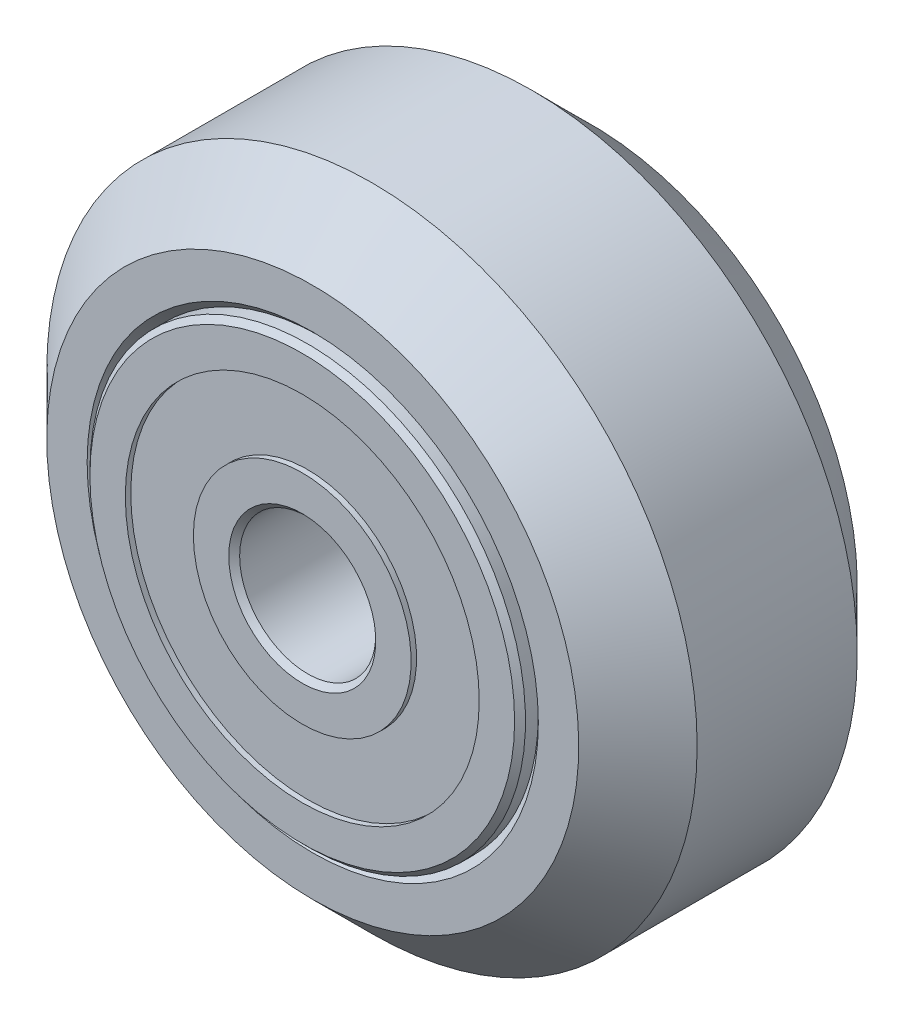
ISO-10303-21;
HEADER;
FILE_DESCRIPTION(('STEP AP214'),'2;1');
FILE_NAME('part.step','',(''),(''),'','','');
FILE_SCHEMA(('AUTOMOTIVE_DESIGN { 1 0 10303 214 1 1 1 1 }'));
ENDSEC;
DATA;
#1=APPLICATION_CONTEXT('core data for automotive mechanical design processes');
#2=APPLICATION_PROTOCOL_DEFINITION('international standard','automotive_design',2000,#1);
#3=PRODUCT_CONTEXT('',#1,'mechanical');
#4=PRODUCT('Part','Part','',(#3));
#5=PRODUCT_RELATED_PRODUCT_CATEGORY('part','',(#4));
#6=PRODUCT_DEFINITION_FORMATION('','',#4);
#7=PRODUCT_DEFINITION_CONTEXT('part definition',#1,'design');
#8=PRODUCT_DEFINITION('design','',#6,#7);
#9=PRODUCT_DEFINITION_SHAPE('','',#8);
#10=(LENGTH_UNIT() NAMED_UNIT(*) SI_UNIT(.MILLI.,.METRE.));
#11=(NAMED_UNIT(*) PLANE_ANGLE_UNIT() SI_UNIT($,.RADIAN.));
#12=(NAMED_UNIT(*) SI_UNIT($,.STERADIAN.) SOLID_ANGLE_UNIT());
#13=UNCERTAINTY_MEASURE_WITH_UNIT(LENGTH_MEASURE(1.E-05),#10,'distance_accuracy_value','');
#14=(GEOMETRIC_REPRESENTATION_CONTEXT(3) GLOBAL_UNCERTAINTY_ASSIGNED_CONTEXT((#13)) GLOBAL_UNIT_ASSIGNED_CONTEXT((#10,
#11,#12)) REPRESENTATION_CONTEXT('',''));
#15=CARTESIAN_POINT('',(0.,0.,0.));
#16=DIRECTION('',(0.,0.,1.));
#17=DIRECTION('',(1.,0.,0.));
#18=AXIS2_PLACEMENT_3D('',#15,#16,#17);
#19=CARTESIAN_POINT('',(0.,0.,0.499999999999998));
#20=DIRECTION('',(0.,0.,1.));
#21=DIRECTION('',(1.,0.,0.));
#22=AXIS2_PLACEMENT_3D('',#19,#20,#21);
#23=PLANE('',#22);
#24=CARTESIAN_POINT('',(0.,0.,0.499999999999998));
#25=DIRECTION('',(0.,0.,1.));
#26=DIRECTION('',(1.,0.,0.));
#27=AXIS2_PLACEMENT_3D('',#24,#25,#26);
#28=CIRCLE('',#27,4.);
#29=CARTESIAN_POINT('',(4.,0.,0.499999999999998));
#30=VERTEX_POINT('',#29);
#31=EDGE_CURVE('P0_E10',#30,#30,#28,.T.);
#32=ORIENTED_EDGE('',*,*,#31,.T.);
#33=EDGE_LOOP('',(#32));
#34=FACE_BOUND('',#33,.T.);
#35=CARTESIAN_POINT('',(0.,0.,0.499999999999998));
#36=DIRECTION('',(0.,0.,1.));
#37=DIRECTION('',(1.,0.,0.));
#38=AXIS2_PLACEMENT_3D('',#35,#36,#37);
#39=CIRCLE('',#38,2.55);
#40=CARTESIAN_POINT('',(2.55,0.,0.499999999999998));
#41=VERTEX_POINT('',#40);
#42=EDGE_CURVE('P0_E25',#41,#41,#39,.T.);
#43=ORIENTED_EDGE('',*,*,#42,.F.);
#44=EDGE_LOOP('',(#43));
#45=FACE_BOUND('',#44,.T.);
#46=ADVANCED_FACE('P0_F14',(#34,#45),#23,.T.);
#47=CARTESIAN_POINT('',(0.,0.,-0.500000000000002));
#48=DIRECTION('',(0.,0.,1.));
#49=DIRECTION('',(1.,0.,0.));
#50=AXIS2_PLACEMENT_3D('',#47,#48,#49);
#51=PLANE('',#50);
#52=CARTESIAN_POINT('',(0.,0.,-0.500000000000002));
#53=DIRECTION('',(0.,0.,1.));
#54=DIRECTION('',(1.,0.,0.));
#55=AXIS2_PLACEMENT_3D('',#52,#53,#54);
#56=CIRCLE('',#55,4.);
#57=CARTESIAN_POINT('',(4.,0.,-0.500000000000002));
#58=VERTEX_POINT('',#57);
#59=EDGE_CURVE('P0_E18',#58,#58,#56,.T.);
#60=ORIENTED_EDGE('',*,*,#59,.F.);
#61=EDGE_LOOP('',(#60));
#62=FACE_BOUND('',#61,.T.);
#63=CARTESIAN_POINT('',(0.,0.,-0.500000000000002));
#64=DIRECTION('',(0.,0.,1.));
#65=DIRECTION('',(1.,0.,0.));
#66=AXIS2_PLACEMENT_3D('',#63,#64,#65);
#67=CIRCLE('',#66,2.55);
#68=CARTESIAN_POINT('',(2.55,0.,-0.500000000000002));
#69=VERTEX_POINT('',#68);
#70=EDGE_CURVE('P0_E27',#69,#69,#67,.T.);
#71=ORIENTED_EDGE('',*,*,#70,.T.);
#72=EDGE_LOOP('',(#71));
#73=FACE_BOUND('',#72,.T.);
#74=ADVANCED_FACE('P0_F37',(#62,#73),#51,.F.);
#75=CARTESIAN_POINT('',(0.,0.,0.499999999999998));
#76=DIRECTION('',(0.,0.,-1.));
#77=DIRECTION('',(-1.,0.,0.));
#78=AXIS2_PLACEMENT_3D('',#75,#76,#77);
#79=CYLINDRICAL_SURFACE('',#78,4.);
#80=ORIENTED_EDGE('',*,*,#31,.F.);
#81=EDGE_LOOP('',(#80));
#82=FACE_BOUND('',#81,.T.);
#83=ORIENTED_EDGE('',*,*,#59,.T.);
#84=EDGE_LOOP('',(#83));
#85=FACE_BOUND('',#84,.T.);
#86=ADVANCED_FACE('P0_F16',(#82,#85),#79,.T.);
#87=CARTESIAN_POINT('',(0.,0.,0.499999999999998));
#88=DIRECTION('',(0.,0.,-1.));
#89=DIRECTION('',(-1.,0.,0.));
#90=AXIS2_PLACEMENT_3D('',#87,#88,#89);
#91=CYLINDRICAL_SURFACE('',#90,2.55);
#92=ORIENTED_EDGE('',*,*,#42,.T.);
#93=EDGE_LOOP('',(#92));
#94=FACE_BOUND('',#93,.T.);
#95=ORIENTED_EDGE('',*,*,#70,.F.);
#96=EDGE_LOOP('',(#95));
#97=FACE_BOUND('',#96,.T.);
#98=ADVANCED_FACE('P0_F33',(#94,#97),#91,.F.);
#99=CLOSED_SHELL('',(#46,#74,#86,#98));
#100=MANIFOLD_SOLID_BREP('P0_B1',#99);
#101=CARTESIAN_POINT('',(0.,0.,5.5));
#102=DIRECTION('',(0.,0.,-1.));
#103=DIRECTION('',(-1.,0.,0.));
#104=AXIS2_PLACEMENT_3D('',#101,#102,#103);
#105=PLANE('',#104);
#106=CARTESIAN_POINT('',(0.,0.,5.5));
#107=DIRECTION('',(0.,0.,-1.));
#108=DIRECTION('',(-1.,0.,0.));
#109=AXIS2_PLACEMENT_3D('',#106,#107,#108);
#110=CIRCLE('',#109,7.8);
#111=CARTESIAN_POINT('',(-7.8,0.,5.5));
#112=VERTEX_POINT('',#111);
#113=EDGE_CURVE('P1_E10',#112,#112,#110,.F.);
#114=ORIENTED_EDGE('',*,*,#113,.T.);
#115=EDGE_LOOP('',(#114));
#116=FACE_BOUND('',#115,.T.);
#117=CARTESIAN_POINT('',(0.,0.,5.5));
#118=DIRECTION('',(0.,0.,-1.));
#119=DIRECTION('',(-1.,0.,0.));
#120=AXIS2_PLACEMENT_3D('',#117,#118,#119);
#121=CIRCLE('',#120,6.5);
#122=CARTESIAN_POINT('',(-6.5,0.,5.5));
#123=VERTEX_POINT('',#122);
#124=EDGE_CURVE('P1_E56',#123,#123,#121,.T.);
#125=ORIENTED_EDGE('',*,*,#124,.T.);
#126=EDGE_LOOP('',(#125));
#127=FACE_BOUND('',#126,.T.);
#128=ADVANCED_FACE('P1_F14',(#116,#127),#105,.F.);
#129=CARTESIAN_POINT('',(0.,0.,0.499999999999998));
#130=DIRECTION('',(0.,0.,-1.));
#131=DIRECTION('',(-1.,0.,0.));
#132=AXIS2_PLACEMENT_3D('',#129,#130,#131);
#133=PLANE('',#132);
#134=CARTESIAN_POINT('',(0.,0.,0.499999999999998));
#135=DIRECTION('',(0.,0.,-1.));
#136=DIRECTION('',(-1.,0.,0.));
#137=AXIS2_PLACEMENT_3D('',#134,#135,#136);
#138=CIRCLE('',#137,2.7);
#139=CARTESIAN_POINT('',(-2.7,0.,0.499999999999998));
#140=VERTEX_POINT('',#139);
#141=EDGE_CURVE('P1_E29',#140,#140,#138,.F.);
#142=ORIENTED_EDGE('',*,*,#141,.T.);
#143=EDGE_LOOP('',(#142));
#144=FACE_BOUND('',#143,.T.);
#145=CARTESIAN_POINT('',(0.,0.,0.499999999999998));
#146=DIRECTION('',(0.,0.,-1.));
#147=DIRECTION('',(-1.,0.,0.));
#148=AXIS2_PLACEMENT_3D('',#145,#146,#147);
#149=CIRCLE('',#148,4.);
#150=CARTESIAN_POINT('',(-4.,0.,0.499999999999998));
#151=VERTEX_POINT('',#150);
#152=EDGE_CURVE('P1_E50',#151,#151,#149,.T.);
#153=ORIENTED_EDGE('',*,*,#152,.T.);
#154=EDGE_LOOP('',(#153));
#155=FACE_BOUND('',#154,.T.);
#156=ADVANCED_FACE('P1_F95',(#144,#155),#133,.T.);
#157=CARTESIAN_POINT('',(0.,0.,0.499999999999998));
#158=DIRECTION('',(0.,0.,1.));
#159=DIRECTION('',(1.,0.,0.));
#160=AXIS2_PLACEMENT_3D('',#157,#158,#159);
#161=CYLINDRICAL_SURFACE('',#160,8.);
#162=CARTESIAN_POINT('',(0.,0.,5.3));
#163=DIRECTION('',(0.,0.,-1.));
#164=DIRECTION('',(-1.,0.,0.));
#165=AXIS2_PLACEMENT_3D('',#162,#163,#164);
#166=CIRCLE('',#165,8.);
#167=CARTESIAN_POINT('',(-8.,0.,5.3));
#168=VERTEX_POINT('',#167);
#169=EDGE_CURVE('P1_E21',#168,#168,#166,.T.);
#170=ORIENTED_EDGE('',*,*,#169,.T.);
#171=EDGE_LOOP('',(#170));
#172=FACE_BOUND('',#171,.T.);
#173=CARTESIAN_POINT('',(0.,0.,0.499999999999998));
#174=DIRECTION('',(0.,0.,-1.));
#175=DIRECTION('',(-1.,0.,0.));
#176=AXIS2_PLACEMENT_3D('',#173,#174,#175);
#177=CIRCLE('',#176,8.);
#178=CARTESIAN_POINT('',(-8.,0.,0.499999999999998));
#179=VERTEX_POINT('',#178);
#180=EDGE_CURVE('P1_E43',#179,#179,#177,.T.);
#181=ORIENTED_EDGE('',*,*,#180,.F.);
#182=EDGE_LOOP('',(#181));
#183=FACE_BOUND('',#182,.T.);
#184=ADVANCED_FACE('P1_F92',(#172,#183),#161,.T.);
#185=CARTESIAN_POINT('',(0.,0.,0.499999999999998));
#186=DIRECTION('',(0.,0.,-1.));
#187=DIRECTION('',(-1.,0.,0.));
#188=AXIS2_PLACEMENT_3D('',#185,#186,#187);
#189=CIRCLE('',#188,6.7);
#190=CARTESIAN_POINT('',(-6.7,0.,0.499999999999998));
#191=VERTEX_POINT('',#190);
#192=EDGE_CURVE('P1_E40',#191,#191,#189,.F.);
#193=ORIENTED_EDGE('',*,*,#192,.T.);
#194=EDGE_LOOP('',(#193));
#195=FACE_BOUND('',#194,.T.);
#196=ORIENTED_EDGE('',*,*,#180,.T.);
#197=EDGE_LOOP('',(#196));
#198=FACE_BOUND('',#197,.T.);
#199=ADVANCED_FACE('P1_F81',(#195,#198),#133,.T.);
#200=CARTESIAN_POINT('',(0.,0.,5.5));
#201=DIRECTION('',(0.,0.,-1.));
#202=DIRECTION('',(-1.,0.,0.));
#203=AXIS2_PLACEMENT_3D('',#200,#201,#202);
#204=CIRCLE('',#203,2.7);
#205=CARTESIAN_POINT('',(-2.7,0.,5.5));
#206=VERTEX_POINT('',#205);
#207=EDGE_CURVE('P1_E25',#206,#206,#204,.T.);
#208=ORIENTED_EDGE('',*,*,#207,.T.);
#209=EDGE_LOOP('',(#208));
#210=FACE_BOUND('',#209,.T.);
#211=CARTESIAN_POINT('',(0.,0.,5.5));
#212=DIRECTION('',(0.,0.,-1.));
#213=DIRECTION('',(-1.,0.,0.));
#214=AXIS2_PLACEMENT_3D('',#211,#212,#213);
#215=CIRCLE('',#214,4.);
#216=CARTESIAN_POINT('',(-4.,0.,5.5));
#217=VERTEX_POINT('',#216);
#218=EDGE_CURVE('P1_E62',#217,#217,#215,.T.);
#219=ORIENTED_EDGE('',*,*,#218,.F.);
#220=EDGE_LOOP('',(#219));
#221=FACE_BOUND('',#220,.T.);
#222=ADVANCED_FACE('P1_F78',(#210,#221),#105,.F.);
#223=CARTESIAN_POINT('',(0.,0.,5.5));
#224=DIRECTION('',(0.,0.,-1.));
#225=DIRECTION('',(-1.,0.,0.));
#226=AXIS2_PLACEMENT_3D('',#223,#224,#225);
#227=CYLINDRICAL_SURFACE('',#226,2.5);
#228=CARTESIAN_POINT('',(0.,0.,0.699999999999991));
#229=DIRECTION('',(0.,0.,-1.));
#230=DIRECTION('',(-1.,0.,0.));
#231=AXIS2_PLACEMENT_3D('',#228,#229,#230);
#232=CIRCLE('',#231,2.5);
#233=CARTESIAN_POINT('',(-2.5,0.,0.699999999999991));
#234=VERTEX_POINT('',#233);
#235=EDGE_CURVE('P1_E34',#234,#234,#232,.T.);
#236=ORIENTED_EDGE('',*,*,#235,.T.);
#237=EDGE_LOOP('',(#236));
#238=FACE_BOUND('',#237,.T.);
#239=CARTESIAN_POINT('',(0.,0.,5.3));
#240=DIRECTION('',(0.,0.,-1.));
#241=DIRECTION('',(-1.,0.,0.));
#242=AXIS2_PLACEMENT_3D('',#239,#240,#241);
#243=CIRCLE('',#242,2.5);
#244=CARTESIAN_POINT('',(-2.5,0.,5.3));
#245=VERTEX_POINT('',#244);
#246=EDGE_CURVE('P1_E37',#245,#245,#243,.F.);
#247=ORIENTED_EDGE('',*,*,#246,.T.);
#248=EDGE_LOOP('',(#247));
#249=FACE_BOUND('',#248,.T.);
#250=ADVANCED_FACE('P1_F80',(#238,#249),#227,.F.);
#251=CARTESIAN_POINT('',(0.,0.,0.699999999999998));
#252=DIRECTION('',(0.,0.,-1.));
#253=DIRECTION('',(-1.,0.,0.));
#254=AXIS2_PLACEMENT_3D('',#251,#252,#253);
#255=PLANE('',#254);
#256=CARTESIAN_POINT('',(0.,0.,0.699999999999998));
#257=DIRECTION('',(0.,0.,-1.));
#258=DIRECTION('',(-1.,0.,0.));
#259=AXIS2_PLACEMENT_3D('',#256,#257,#258);
#260=CIRCLE('',#259,4.);
#261=CARTESIAN_POINT('',(-4.,0.,0.699999999999998));
#262=VERTEX_POINT('',#261);
#263=EDGE_CURVE('P1_E49',#262,#262,#260,.T.);
#264=ORIENTED_EDGE('',*,*,#263,.F.);
#265=EDGE_LOOP('',(#264));
#266=FACE_BOUND('',#265,.T.);
#267=CARTESIAN_POINT('',(0.,0.,0.699999999999998));
#268=DIRECTION('',(0.,0.,-1.));
#269=DIRECTION('',(-1.,0.,0.));
#270=AXIS2_PLACEMENT_3D('',#267,#268,#269);
#271=CIRCLE('',#270,6.5);
#272=CARTESIAN_POINT('',(-6.5,0.,0.699999999999998));
#273=VERTEX_POINT('',#272);
#274=EDGE_CURVE('P1_E46',#273,#273,#271,.T.);
#275=ORIENTED_EDGE('',*,*,#274,.T.);
#276=EDGE_LOOP('',(#275));
#277=FACE_BOUND('',#276,.T.);
#278=ADVANCED_FACE('P1_F89',(#266,#277),#255,.T.);
#279=CARTESIAN_POINT('',(0.,0.,0.699999999999998));
#280=DIRECTION('',(0.,0.,-1.));
#281=DIRECTION('',(-1.,0.,0.));
#282=AXIS2_PLACEMENT_3D('',#279,#280,#281);
#283=CYLINDRICAL_SURFACE('',#282,4.);
#284=ORIENTED_EDGE('',*,*,#263,.T.);
#285=EDGE_LOOP('',(#284));
#286=FACE_BOUND('',#285,.T.);
#287=ORIENTED_EDGE('',*,*,#152,.F.);
#288=EDGE_LOOP('',(#287));
#289=FACE_BOUND('',#288,.T.);
#290=ADVANCED_FACE('P1_F111',(#286,#289),#283,.T.);
#291=CARTESIAN_POINT('',(0.,0.,5.3));
#292=DIRECTION('',(0.,0.,1.));
#293=DIRECTION('',(-1.,0.,0.));
#294=AXIS2_PLACEMENT_3D('',#291,#292,#293);
#295=PLANE('',#294);
#296=CARTESIAN_POINT('',(0.,0.,5.3));
#297=DIRECTION('',(0.,0.,-1.));
#298=DIRECTION('',(-1.,0.,0.));
#299=AXIS2_PLACEMENT_3D('',#296,#297,#298);
#300=CIRCLE('',#299,6.5);
#301=CARTESIAN_POINT('',(-6.5,0.,5.3));
#302=VERTEX_POINT('',#301);
#303=EDGE_CURVE('P1_E53',#302,#302,#300,.T.);
#304=ORIENTED_EDGE('',*,*,#303,.F.);
#305=EDGE_LOOP('',(#304));
#306=FACE_BOUND('',#305,.T.);
#307=CARTESIAN_POINT('',(0.,0.,5.3));
#308=DIRECTION('',(0.,0.,-1.));
#309=DIRECTION('',(-1.,0.,0.));
#310=AXIS2_PLACEMENT_3D('',#307,#308,#309);
#311=CIRCLE('',#310,4.);
#312=CARTESIAN_POINT('',(-4.,0.,5.3));
#313=VERTEX_POINT('',#312);
#314=EDGE_CURVE('P1_E59',#313,#313,#311,.T.);
#315=ORIENTED_EDGE('',*,*,#314,.T.);
#316=EDGE_LOOP('',(#315));
#317=FACE_BOUND('',#316,.T.);
#318=ADVANCED_FACE('P1_F68',(#306,#317),#295,.T.);
#319=CARTESIAN_POINT('',(0.,0.,5.3));
#320=DIRECTION('',(0.,0.,1.));
#321=DIRECTION('',(1.,0.,0.));
#322=AXIS2_PLACEMENT_3D('',#319,#320,#321);
#323=CYLINDRICAL_SURFACE('',#322,6.5);
#324=ORIENTED_EDGE('',*,*,#303,.T.);
#325=EDGE_LOOP('',(#324));
#326=FACE_BOUND('',#325,.T.);
#327=ORIENTED_EDGE('',*,*,#124,.F.);
#328=EDGE_LOOP('',(#327));
#329=FACE_BOUND('',#328,.T.);
#330=ADVANCED_FACE('P1_F74',(#326,#329),#323,.F.);
#331=CARTESIAN_POINT('',(0.,0.,5.3));
#332=DIRECTION('',(0.,0.,1.));
#333=DIRECTION('',(1.,0.,0.));
#334=AXIS2_PLACEMENT_3D('',#331,#332,#333);
#335=CYLINDRICAL_SURFACE('',#334,4.);
#336=ORIENTED_EDGE('',*,*,#314,.F.);
#337=EDGE_LOOP('',(#336));
#338=FACE_BOUND('',#337,.T.);
#339=ORIENTED_EDGE('',*,*,#218,.T.);
#340=EDGE_LOOP('',(#339));
#341=FACE_BOUND('',#340,.T.);
#342=ADVANCED_FACE('P1_F70',(#338,#341),#335,.T.);
#343=CARTESIAN_POINT('',(0.,0.,0.699999999999995));
#344=DIRECTION('',(0.,0.,-1.));
#345=DIRECTION('',(-1.,0.,0.));
#346=AXIS2_PLACEMENT_3D('',#343,#344,#345);
#347=CONICAL_SURFACE('',#346,6.5,0.785398163397448);
#348=ORIENTED_EDGE('',*,*,#192,.F.);
#349=EDGE_LOOP('',(#348));
#350=FACE_BOUND('',#349,.T.);
#351=ORIENTED_EDGE('',*,*,#274,.F.);
#352=EDGE_LOOP('',(#351));
#353=FACE_BOUND('',#352,.T.);
#354=ADVANCED_FACE('P1_F73',(#350,#353),#347,.F.);
#355=CARTESIAN_POINT('',(0.,0.,0.699999999999991));
#356=DIRECTION('',(0.,0.,-1.));
#357=DIRECTION('',(-1.,0.,0.));
#358=AXIS2_PLACEMENT_3D('',#355,#356,#357);
#359=CONICAL_SURFACE('',#358,2.5,0.785398163397458);
#360=CARTESIAN_POINT('',(-2.7,0.,0.499999999999998));
#361=CARTESIAN_POINT('',(-2.69791666666666,0.,0.502083333333331));
#362=CARTESIAN_POINT('',(-2.69583333333333,0.,0.504166666666664));
#363=CARTESIAN_POINT('',(-2.69166666666666,0.,0.508333333333331));
#364=CARTESIAN_POINT('',(-2.68958333333333,0.,0.510416666666664));
#365=CARTESIAN_POINT('',(-2.68541666666667,0.,0.514583333333331));
#366=CARTESIAN_POINT('',(-2.68333333333333,0.,0.516666666666664));
#367=CARTESIAN_POINT('',(-2.67916666666667,0.,0.52083333333333));
#368=CARTESIAN_POINT('',(-2.67708333333333,0.,0.522916666666664));
#369=CARTESIAN_POINT('',(-2.67291666666666,0.,0.52708333333333));
#370=CARTESIAN_POINT('',(-2.67083333333333,0.,0.529166666666663));
#371=CARTESIAN_POINT('',(-2.66666666666667,0.,0.53333333333333));
#372=CARTESIAN_POINT('',(-2.66458333333333,0.,0.535416666666663));
#373=CARTESIAN_POINT('',(-2.66041666666667,0.,0.53958333333333));
#374=CARTESIAN_POINT('',(-2.65833333333333,0.,0.541666666666663));
#375=CARTESIAN_POINT('',(-2.65416666666667,0.,0.54583333333333));
#376=CARTESIAN_POINT('',(-2.65208333333333,0.,0.547916666666663));
#377=CARTESIAN_POINT('',(-2.64791666666667,0.,0.552083333333329));
#378=CARTESIAN_POINT('',(-2.64583333333333,0.,0.554166666666663));
#379=CARTESIAN_POINT('',(-2.64166666666667,0.,0.558333333333329));
#380=CARTESIAN_POINT('',(-2.63958333333333,0.,0.560416666666662));
#381=CARTESIAN_POINT('',(-2.63541666666667,0.,0.564583333333329));
#382=CARTESIAN_POINT('',(-2.63333333333333,0.,0.566666666666662));
#383=CARTESIAN_POINT('',(-2.62916666666667,0.,0.570833333333329));
#384=CARTESIAN_POINT('',(-2.62708333333333,0.,0.572916666666662));
#385=CARTESIAN_POINT('',(-2.62291666666667,0.,0.577083333333329));
#386=CARTESIAN_POINT('',(-2.62083333333333,0.,0.579166666666662));
#387=CARTESIAN_POINT('',(-2.61666666666667,0.,0.583333333333328));
#388=CARTESIAN_POINT('',(-2.61458333333333,0.,0.585416666666662));
#389=CARTESIAN_POINT('',(-2.61041666666667,0.,0.589583333333328));
#390=CARTESIAN_POINT('',(-2.60833333333333,0.,0.591666666666661));
#391=CARTESIAN_POINT('',(-2.60416666666667,0.,0.595833333333328));
#392=CARTESIAN_POINT('',(-2.60208333333333,0.,0.597916666666661));
#393=CARTESIAN_POINT('',(-2.59791666666667,0.,0.602083333333328));
#394=CARTESIAN_POINT('',(-2.59583333333333,0.,0.604166666666661));
#395=CARTESIAN_POINT('',(-2.59166666666667,0.,0.608333333333328));
#396=CARTESIAN_POINT('',(-2.58958333333333,0.,0.610416666666661));
#397=CARTESIAN_POINT('',(-2.58541666666667,0.,0.614583333333327));
#398=CARTESIAN_POINT('',(-2.58333333333333,0.,0.616666666666661));
#399=CARTESIAN_POINT('',(-2.57916666666667,0.,0.620833333333327));
#400=CARTESIAN_POINT('',(-2.57708333333333,0.,0.62291666666666));
#401=CARTESIAN_POINT('',(-2.57291666666667,0.,0.627083333333327));
#402=CARTESIAN_POINT('',(-2.57083333333333,0.,0.62916666666666));
#403=CARTESIAN_POINT('',(-2.56666666666667,0.,0.633333333333327));
#404=CARTESIAN_POINT('',(-2.56458333333333,0.,0.63541666666666));
#405=CARTESIAN_POINT('',(-2.56041666666667,0.,0.639583333333327));
#406=CARTESIAN_POINT('',(-2.55833333333333,0.,0.64166666666666));
#407=CARTESIAN_POINT('',(-2.55416666666667,0.,0.645833333333326));
#408=CARTESIAN_POINT('',(-2.55208333333333,0.,0.64791666666666));
#409=CARTESIAN_POINT('',(-2.54791666666667,0.,0.652083333333326));
#410=CARTESIAN_POINT('',(-2.54583333333333,0.,0.654166666666659));
#411=CARTESIAN_POINT('',(-2.54166666666667,0.,0.658333333333326));
#412=CARTESIAN_POINT('',(-2.53958333333333,0.,0.660416666666659));
#413=CARTESIAN_POINT('',(-2.53541666666667,0.,0.664583333333326));
#414=CARTESIAN_POINT('',(-2.53333333333333,0.,0.666666666666659));
#415=CARTESIAN_POINT('',(-2.52916666666667,0.,0.670833333333326));
#416=CARTESIAN_POINT('',(-2.52708333333333,0.,0.672916666666659));
#417=CARTESIAN_POINT('',(-2.52291666666667,0.,0.677083333333326));
#418=CARTESIAN_POINT('',(-2.52083333333333,0.,0.679166666666659));
#419=CARTESIAN_POINT('',(-2.51666666666667,0.,0.683333333333325));
#420=CARTESIAN_POINT('',(-2.51458333333333,0.,0.685416666666658));
#421=CARTESIAN_POINT('',(-2.51041666666667,0.,0.689583333333325));
#422=CARTESIAN_POINT('',(-2.50833333333333,0.,0.691666666666658));
#423=CARTESIAN_POINT('',(-2.50416666666667,0.,0.695833333333325));
#424=CARTESIAN_POINT('',(-2.50208333333333,0.,0.697916666666658));
#425=CARTESIAN_POINT('',(-2.5,0.,0.699999999999991));
#426=B_SPLINE_CURVE_WITH_KNOTS('',3,(#360,#361,#362,#363,#364,#365,#366,#367,#368,#369,#370,
#371,#372,#373,#374,#375,#376,#377,#378,#379,#380,#381,#382,#383,#384,#385,#386,#387,#388,#389,
#390,#391,#392,#393,#394,#395,#396,#397,#398,#399,#400,#401,#402,#403,#404,#405,#406,#407,#408,
#409,#410,#411,#412,#413,#414,#415,#416,#417,#418,#419,#420,#421,#422,#423,#424,#425),
.UNSPECIFIED.,.F.,.F.,(4,2,2,2,2,2,2,2,2,2,2,2,2,2,2,2,2,2,2,2,2,2,2,2,2,2,2,2,2,2,2,2,4),(0.,
0.00883883476483156,0.0176776695296634,0.0265165042944949,0.0353553390593264,0.0441941738241583,
0.0530330085889897,0.0618718433538216,0.0707106781186531,0.0795495128834846,0.0883883476483164,
0.097227182413148,0.10606601717798,0.114904851942811,0.123743686707643,0.132582521472475,
0.141421356237306,0.150260191002138,0.159099025766969,0.167937860531801,0.176776695296633,
0.185615530061464,0.194454364826296,0.203293199591128,0.21213203435596,0.220970869120791,
0.229809703885623,0.238648538650454,0.247487373415286,0.256326208180118,0.265165042944949,
0.274003877709781,0.282842712474613),.UNSPECIFIED.);
#427=EDGE_CURVE('P1_BSEAM127',#140,#234,#426,.T.);
#428=ORIENTED_EDGE('',*,*,#141,.F.);
#429=ORIENTED_EDGE('',*,*,#235,.F.);
#430=ORIENTED_EDGE('',*,*,#427,.T.);
#431=ORIENTED_EDGE('',*,*,#427,.F.);
#432=EDGE_LOOP('',(#428,#430,#429,#431));
#433=FACE_BOUND('',#432,.T.);
#434=ADVANCED_FACE('P1_F127',(#433),#359,.F.);
#435=CARTESIAN_POINT('',(0.,0.,5.5));
#436=DIRECTION('',(0.,0.,1.));
#437=DIRECTION('',(1.,0.,0.));
#438=AXIS2_PLACEMENT_3D('',#435,#436,#437);
#439=CONICAL_SURFACE('',#438,2.7,0.785398163397443);
#440=ORIENTED_EDGE('',*,*,#246,.F.);
#441=EDGE_LOOP('',(#440));
#442=FACE_BOUND('',#441,.T.);
#443=ORIENTED_EDGE('',*,*,#207,.F.);
#444=EDGE_LOOP('',(#443));
#445=FACE_BOUND('',#444,.T.);
#446=ADVANCED_FACE('P1_F133',(#442,#445),#439,.F.);
#447=CARTESIAN_POINT('',(0.,0.,5.3));
#448=DIRECTION('',(0.,0.,-1.));
#449=DIRECTION('',(-1.,0.,0.));
#450=AXIS2_PLACEMENT_3D('',#447,#448,#449);
#451=CONICAL_SURFACE('',#450,8.,0.785398163397453);
#452=ORIENTED_EDGE('',*,*,#113,.F.);
#453=EDGE_LOOP('',(#452));
#454=FACE_BOUND('',#453,.T.);
#455=ORIENTED_EDGE('',*,*,#169,.F.);
#456=EDGE_LOOP('',(#455));
#457=FACE_BOUND('',#456,.T.);
#458=ADVANCED_FACE('P1_F16',(#454,#457),#451,.T.);
#459=CLOSED_SHELL('',(#128,#156,#184,#199,#222,#250,#278,#290,#318,#330,#342,#354,#434,#446,#458));
#460=MANIFOLD_SOLID_BREP('P1_B1',#459);
#461=CARTESIAN_POINT('',(0.,0.,-5.5));
#462=DIRECTION('',(0.,0.,1.));
#463=DIRECTION('',(0.,1.,0.));
#464=AXIS2_PLACEMENT_3D('',#461,#462,#463);
#465=PLANE('',#464);
#466=CARTESIAN_POINT('',(0.,0.,-5.5));
#467=DIRECTION('',(0.,0.,1.));
#468=DIRECTION('',(0.,1.,0.));
#469=AXIS2_PLACEMENT_3D('',#466,#467,#468);
#470=CIRCLE('',#469,7.8);
#471=CARTESIAN_POINT('',(0.,7.8,-5.5));
#472=VERTEX_POINT('',#471);
#473=EDGE_CURVE('P2_E10',#472,#472,#470,.F.);
#474=ORIENTED_EDGE('',*,*,#473,.T.);
#475=EDGE_LOOP('',(#474));
#476=FACE_BOUND('',#475,.T.);
#477=CARTESIAN_POINT('',(0.,0.,-5.5));
#478=DIRECTION('',(0.,0.,1.));
#479=DIRECTION('',(0.,1.,0.));
#480=AXIS2_PLACEMENT_3D('',#477,#478,#479);
#481=CIRCLE('',#480,6.5);
#482=CARTESIAN_POINT('',(0.,6.5,-5.5));
#483=VERTEX_POINT('',#482);
#484=EDGE_CURVE('P2_E56',#483,#483,#481,.T.);
#485=ORIENTED_EDGE('',*,*,#484,.T.);
#486=EDGE_LOOP('',(#485));
#487=FACE_BOUND('',#486,.T.);
#488=ADVANCED_FACE('P2_F14',(#476,#487),#465,.F.);
#489=CARTESIAN_POINT('',(0.,0.,-0.500000000000003));
#490=DIRECTION('',(0.,0.,1.));
#491=DIRECTION('',(0.,1.,0.));
#492=AXIS2_PLACEMENT_3D('',#489,#490,#491);
#493=PLANE('',#492);
#494=CARTESIAN_POINT('',(0.,0.,-0.500000000000003));
#495=DIRECTION('',(0.,0.,1.));
#496=DIRECTION('',(0.,1.,0.));
#497=AXIS2_PLACEMENT_3D('',#494,#495,#496);
#498=CIRCLE('',#497,2.7);
#499=CARTESIAN_POINT('',(0.,2.7,-0.500000000000002));
#500=VERTEX_POINT('',#499);
#501=EDGE_CURVE('P2_E29',#500,#500,#498,.F.);
#502=ORIENTED_EDGE('',*,*,#501,.T.);
#503=EDGE_LOOP('',(#502));
#504=FACE_BOUND('',#503,.T.);
#505=CARTESIAN_POINT('',(0.,0.,-0.500000000000003));
#506=DIRECTION('',(0.,0.,1.));
#507=DIRECTION('',(0.,1.,0.));
#508=AXIS2_PLACEMENT_3D('',#505,#506,#507);
#509=CIRCLE('',#508,4.);
#510=CARTESIAN_POINT('',(0.,4.,-0.500000000000002));
#511=VERTEX_POINT('',#510);
#512=EDGE_CURVE('P2_E50',#511,#511,#509,.T.);
#513=ORIENTED_EDGE('',*,*,#512,.T.);
#514=EDGE_LOOP('',(#513));
#515=FACE_BOUND('',#514,.T.);
#516=ADVANCED_FACE('P2_F95',(#504,#515),#493,.T.);
#517=CARTESIAN_POINT('',(0.,0.,-0.500000000000003));
#518=DIRECTION('',(0.,0.,-1.));
#519=DIRECTION('',(0.,-1.,0.));
#520=AXIS2_PLACEMENT_3D('',#517,#518,#519);
#521=CYLINDRICAL_SURFACE('',#520,8.);
#522=CARTESIAN_POINT('',(0.,0.,-5.30000000000001));
#523=DIRECTION('',(0.,0.,1.));
#524=DIRECTION('',(0.,1.,0.));
#525=AXIS2_PLACEMENT_3D('',#522,#523,#524);
#526=CIRCLE('',#525,8.);
#527=CARTESIAN_POINT('',(0.,8.,-5.3));
#528=VERTEX_POINT('',#527);
#529=EDGE_CURVE('P2_E21',#528,#528,#526,.T.);
#530=ORIENTED_EDGE('',*,*,#529,.T.);
#531=EDGE_LOOP('',(#530));
#532=FACE_BOUND('',#531,.T.);
#533=CARTESIAN_POINT('',(0.,0.,-0.500000000000003));
#534=DIRECTION('',(0.,0.,1.));
#535=DIRECTION('',(0.,1.,0.));
#536=AXIS2_PLACEMENT_3D('',#533,#534,#535);
#537=CIRCLE('',#536,8.);
#538=CARTESIAN_POINT('',(0.,8.,-0.500000000000001));
#539=VERTEX_POINT('',#538);
#540=EDGE_CURVE('P2_E43',#539,#539,#537,.T.);
#541=ORIENTED_EDGE('',*,*,#540,.F.);
#542=EDGE_LOOP('',(#541));
#543=FACE_BOUND('',#542,.T.);
#544=ADVANCED_FACE('P2_F92',(#532,#543),#521,.T.);
#545=CARTESIAN_POINT('',(0.,0.,-0.500000000000003));
#546=DIRECTION('',(0.,0.,1.));
#547=DIRECTION('',(0.,1.,0.));
#548=AXIS2_PLACEMENT_3D('',#545,#546,#547);
#549=CIRCLE('',#548,6.7);
#550=CARTESIAN_POINT('',(0.,6.7,-0.500000000000002));
#551=VERTEX_POINT('',#550);
#552=EDGE_CURVE('P2_E40',#551,#551,#549,.F.);
#553=ORIENTED_EDGE('',*,*,#552,.T.);
#554=EDGE_LOOP('',(#553));
#555=FACE_BOUND('',#554,.T.);
#556=ORIENTED_EDGE('',*,*,#540,.T.);
#557=EDGE_LOOP('',(#556));
#558=FACE_BOUND('',#557,.T.);
#559=ADVANCED_FACE('P2_F81',(#555,#558),#493,.T.);
#560=CARTESIAN_POINT('',(0.,0.,-5.5));
#561=DIRECTION('',(0.,0.,1.));
#562=DIRECTION('',(0.,1.,0.));
#563=AXIS2_PLACEMENT_3D('',#560,#561,#562);
#564=CIRCLE('',#563,2.7);
#565=CARTESIAN_POINT('',(0.,2.7,-5.5));
#566=VERTEX_POINT('',#565);
#567=EDGE_CURVE('P2_E25',#566,#566,#564,.T.);
#568=ORIENTED_EDGE('',*,*,#567,.T.);
#569=EDGE_LOOP('',(#568));
#570=FACE_BOUND('',#569,.T.);
#571=CARTESIAN_POINT('',(0.,0.,-5.5));
#572=DIRECTION('',(0.,0.,1.));
#573=DIRECTION('',(0.,1.,0.));
#574=AXIS2_PLACEMENT_3D('',#571,#572,#573);
#575=CIRCLE('',#574,4.);
#576=CARTESIAN_POINT('',(0.,4.,-5.5));
#577=VERTEX_POINT('',#576);
#578=EDGE_CURVE('P2_E62',#577,#577,#575,.T.);
#579=ORIENTED_EDGE('',*,*,#578,.F.);
#580=EDGE_LOOP('',(#579));
#581=FACE_BOUND('',#580,.T.);
#582=ADVANCED_FACE('P2_F78',(#570,#581),#465,.F.);
#583=CARTESIAN_POINT('',(0.,0.,-5.5));
#584=DIRECTION('',(0.,0.,1.));
#585=DIRECTION('',(0.,1.,0.));
#586=AXIS2_PLACEMENT_3D('',#583,#584,#585);
#587=CYLINDRICAL_SURFACE('',#586,2.5);
#588=CARTESIAN_POINT('',(0.,0.,-0.699999999999996));
#589=DIRECTION('',(0.,0.,1.));
#590=DIRECTION('',(0.,1.,0.));
#591=AXIS2_PLACEMENT_3D('',#588,#589,#590);
#592=CIRCLE('',#591,2.5);
#593=CARTESIAN_POINT('',(0.,2.5,-0.699999999999996));
#594=VERTEX_POINT('',#593);
#595=EDGE_CURVE('P2_E34',#594,#594,#592,.T.);
#596=ORIENTED_EDGE('',*,*,#595,.T.);
#597=EDGE_LOOP('',(#596));
#598=FACE_BOUND('',#597,.T.);
#599=CARTESIAN_POINT('',(0.,0.,-5.3));
#600=DIRECTION('',(0.,0.,1.));
#601=DIRECTION('',(0.,1.,0.));
#602=AXIS2_PLACEMENT_3D('',#599,#600,#601);
#603=CIRCLE('',#602,2.5);
#604=CARTESIAN_POINT('',(0.,2.5,-5.3));
#605=VERTEX_POINT('',#604);
#606=EDGE_CURVE('P2_E37',#605,#605,#603,.F.);
#607=ORIENTED_EDGE('',*,*,#606,.T.);
#608=EDGE_LOOP('',(#607));
#609=FACE_BOUND('',#608,.T.);
#610=ADVANCED_FACE('P2_F80',(#598,#609),#587,.F.);
#611=CARTESIAN_POINT('',(0.,0.,-0.700000000000003));
#612=DIRECTION('',(0.,0.,1.));
#613=DIRECTION('',(0.,1.,0.));
#614=AXIS2_PLACEMENT_3D('',#611,#612,#613);
#615=PLANE('',#614);
#616=CARTESIAN_POINT('',(0.,0.,-0.700000000000003));
#617=DIRECTION('',(0.,0.,1.));
#618=DIRECTION('',(0.,1.,0.));
#619=AXIS2_PLACEMENT_3D('',#616,#617,#618);
#620=CIRCLE('',#619,4.);
#621=CARTESIAN_POINT('',(0.,4.,-0.700000000000002));
#622=VERTEX_POINT('',#621);
#623=EDGE_CURVE('P2_E49',#622,#622,#620,.T.);
#624=ORIENTED_EDGE('',*,*,#623,.F.);
#625=EDGE_LOOP('',(#624));
#626=FACE_BOUND('',#625,.T.);
#627=CARTESIAN_POINT('',(0.,0.,-0.700000000000003));
#628=DIRECTION('',(0.,0.,1.));
#629=DIRECTION('',(0.,1.,0.));
#630=AXIS2_PLACEMENT_3D('',#627,#628,#629);
#631=CIRCLE('',#630,6.5);
#632=CARTESIAN_POINT('',(0.,6.5,-0.700000000000002));
#633=VERTEX_POINT('',#632);
#634=EDGE_CURVE('P2_E46',#633,#633,#631,.T.);
#635=ORIENTED_EDGE('',*,*,#634,.T.);
#636=EDGE_LOOP('',(#635));
#637=FACE_BOUND('',#636,.T.);
#638=ADVANCED_FACE('P2_F89',(#626,#637),#615,.T.);
#639=CARTESIAN_POINT('',(0.,0.,-0.700000000000003));
#640=DIRECTION('',(0.,0.,1.));
#641=DIRECTION('',(0.,1.,0.));
#642=AXIS2_PLACEMENT_3D('',#639,#640,#641);
#643=CYLINDRICAL_SURFACE('',#642,4.);
#644=ORIENTED_EDGE('',*,*,#623,.T.);
#645=EDGE_LOOP('',(#644));
#646=FACE_BOUND('',#645,.T.);
#647=ORIENTED_EDGE('',*,*,#512,.F.);
#648=EDGE_LOOP('',(#647));
#649=FACE_BOUND('',#648,.T.);
#650=ADVANCED_FACE('P2_F111',(#646,#649),#643,.T.);
#651=CARTESIAN_POINT('',(0.,0.,-5.3));
#652=DIRECTION('',(0.,0.,-1.));
#653=DIRECTION('',(0.,1.,0.));
#654=AXIS2_PLACEMENT_3D('',#651,#652,#653);
#655=PLANE('',#654);
#656=CARTESIAN_POINT('',(0.,0.,-5.3));
#657=DIRECTION('',(0.,0.,1.));
#658=DIRECTION('',(0.,1.,0.));
#659=AXIS2_PLACEMENT_3D('',#656,#657,#658);
#660=CIRCLE('',#659,6.5);
#661=CARTESIAN_POINT('',(0.,6.5,-5.3));
#662=VERTEX_POINT('',#661);
#663=EDGE_CURVE('P2_E53',#662,#662,#660,.T.);
#664=ORIENTED_EDGE('',*,*,#663,.F.);
#665=EDGE_LOOP('',(#664));
#666=FACE_BOUND('',#665,.T.);
#667=CARTESIAN_POINT('',(0.,0.,-5.3));
#668=DIRECTION('',(0.,0.,1.));
#669=DIRECTION('',(0.,1.,0.));
#670=AXIS2_PLACEMENT_3D('',#667,#668,#669);
#671=CIRCLE('',#670,4.);
#672=CARTESIAN_POINT('',(0.,4.,-5.3));
#673=VERTEX_POINT('',#672);
#674=EDGE_CURVE('P2_E59',#673,#673,#671,.T.);
#675=ORIENTED_EDGE('',*,*,#674,.T.);
#676=EDGE_LOOP('',(#675));
#677=FACE_BOUND('',#676,.T.);
#678=ADVANCED_FACE('P2_F68',(#666,#677),#655,.T.);
#679=CARTESIAN_POINT('',(0.,0.,-5.3));
#680=DIRECTION('',(0.,0.,-1.));
#681=DIRECTION('',(0.,-1.,0.));
#682=AXIS2_PLACEMENT_3D('',#679,#680,#681);
#683=CYLINDRICAL_SURFACE('',#682,6.5);
#684=ORIENTED_EDGE('',*,*,#663,.T.);
#685=EDGE_LOOP('',(#684));
#686=FACE_BOUND('',#685,.T.);
#687=ORIENTED_EDGE('',*,*,#484,.F.);
#688=EDGE_LOOP('',(#687));
#689=FACE_BOUND('',#688,.T.);
#690=ADVANCED_FACE('P2_F74',(#686,#689),#683,.F.);
#691=CARTESIAN_POINT('',(0.,0.,-5.3));
#692=DIRECTION('',(0.,0.,-1.));
#693=DIRECTION('',(0.,-1.,0.));
#694=AXIS2_PLACEMENT_3D('',#691,#692,#693);
#695=CYLINDRICAL_SURFACE('',#694,4.);
#696=ORIENTED_EDGE('',*,*,#674,.F.);
#697=EDGE_LOOP('',(#696));
#698=FACE_BOUND('',#697,.T.);
#699=ORIENTED_EDGE('',*,*,#578,.T.);
#700=EDGE_LOOP('',(#699));
#701=FACE_BOUND('',#700,.T.);
#702=ADVANCED_FACE('P2_F70',(#698,#701),#695,.T.);
#703=CARTESIAN_POINT('',(0.,0.,-0.7));
#704=DIRECTION('',(0.,0.,1.));
#705=DIRECTION('',(0.,1.,0.));
#706=AXIS2_PLACEMENT_3D('',#703,#704,#705);
#707=CONICAL_SURFACE('',#706,6.5,0.785398163397448);
#708=ORIENTED_EDGE('',*,*,#552,.F.);
#709=EDGE_LOOP('',(#708));
#710=FACE_BOUND('',#709,.T.);
#711=ORIENTED_EDGE('',*,*,#634,.F.);
#712=EDGE_LOOP('',(#711));
#713=FACE_BOUND('',#712,.T.);
#714=ADVANCED_FACE('P2_F73',(#710,#713),#707,.F.);
#715=CARTESIAN_POINT('',(0.,0.,-0.699999999999996));
#716=DIRECTION('',(0.,0.,1.));
#717=DIRECTION('',(0.,1.,0.));
#718=AXIS2_PLACEMENT_3D('',#715,#716,#717);
#719=CONICAL_SURFACE('',#718,2.5,0.785398163397458);
#720=CARTESIAN_POINT('',(0.,2.7,-0.500000000000002));
#721=CARTESIAN_POINT('',(0.,2.69791666666667,-0.502083333333336));
#722=CARTESIAN_POINT('',(0.,2.69583333333333,-0.504166666666669));
#723=CARTESIAN_POINT('',(0.,2.69166666666667,-0.508333333333335));
#724=CARTESIAN_POINT('',(0.,2.68958333333333,-0.510416666666668));
#725=CARTESIAN_POINT('',(0.,2.68541666666667,-0.514583333333335));
#726=CARTESIAN_POINT('',(0.,2.68333333333333,-0.516666666666668));
#727=CARTESIAN_POINT('',(0.,2.67916666666667,-0.520833333333335));
#728=CARTESIAN_POINT('',(0.,2.67708333333333,-0.522916666666668));
#729=CARTESIAN_POINT('',(0.,2.67291666666667,-0.527083333333335));
#730=CARTESIAN_POINT('',(0.,2.67083333333333,-0.529166666666668));
#731=CARTESIAN_POINT('',(0.,2.66666666666667,-0.533333333333334));
#732=CARTESIAN_POINT('',(0.,2.66458333333333,-0.535416666666668));
#733=CARTESIAN_POINT('',(0.,2.66041666666667,-0.539583333333334));
#734=CARTESIAN_POINT('',(0.,2.65833333333333,-0.541666666666667));
#735=CARTESIAN_POINT('',(0.,2.65416666666667,-0.545833333333334));
#736=CARTESIAN_POINT('',(0.,2.65208333333333,-0.547916666666667));
#737=CARTESIAN_POINT('',(0.,2.64791666666667,-0.552083333333334));
#738=CARTESIAN_POINT('',(0.,2.64583333333333,-0.554166666666667));
#739=CARTESIAN_POINT('',(0.,2.64166666666667,-0.558333333333334));
#740=CARTESIAN_POINT('',(0.,2.63958333333333,-0.560416666666667));
#741=CARTESIAN_POINT('',(0.,2.63541666666667,-0.564583333333333));
#742=CARTESIAN_POINT('',(0.,2.63333333333333,-0.566666666666667));
#743=CARTESIAN_POINT('',(0.,2.62916666666667,-0.570833333333333));
#744=CARTESIAN_POINT('',(0.,2.62708333333333,-0.572916666666666));
#745=CARTESIAN_POINT('',(0.,2.62291666666667,-0.577083333333333));
#746=CARTESIAN_POINT('',(0.,2.62083333333333,-0.579166666666666));
#747=CARTESIAN_POINT('',(0.,2.61666666666667,-0.583333333333333));
#748=CARTESIAN_POINT('',(0.,2.61458333333333,-0.585416666666666));
#749=CARTESIAN_POINT('',(0.,2.61041666666667,-0.589583333333333));
#750=CARTESIAN_POINT('',(0.,2.60833333333333,-0.591666666666666));
#751=CARTESIAN_POINT('',(0.,2.60416666666667,-0.595833333333332));
#752=CARTESIAN_POINT('',(0.,2.60208333333333,-0.597916666666666));
#753=CARTESIAN_POINT('',(0.,2.59791666666667,-0.602083333333332));
#754=CARTESIAN_POINT('',(0.,2.59583333333333,-0.604166666666665));
#755=CARTESIAN_POINT('',(0.,2.59166666666667,-0.608333333333332));
#756=CARTESIAN_POINT('',(0.,2.58958333333333,-0.610416666666665));
#757=CARTESIAN_POINT('',(0.,2.58541666666667,-0.614583333333332));
#758=CARTESIAN_POINT('',(0.,2.58333333333333,-0.616666666666665));
#759=CARTESIAN_POINT('',(0.,2.57916666666667,-0.620833333333332));
#760=CARTESIAN_POINT('',(0.,2.57708333333333,-0.622916666666665));
#761=CARTESIAN_POINT('',(0.,2.57291666666667,-0.627083333333331));
#762=CARTESIAN_POINT('',(0.,2.57083333333333,-0.629166666666665));
#763=CARTESIAN_POINT('',(0.,2.56666666666667,-0.633333333333331));
#764=CARTESIAN_POINT('',(0.,2.56458333333333,-0.635416666666664));
#765=CARTESIAN_POINT('',(0.,2.56041666666667,-0.639583333333331));
#766=CARTESIAN_POINT('',(0.,2.55833333333333,-0.641666666666664));
#767=CARTESIAN_POINT('',(0.,2.55416666666667,-0.645833333333331));
#768=CARTESIAN_POINT('',(0.,2.55208333333333,-0.647916666666664));
#769=CARTESIAN_POINT('',(0.,2.54791666666667,-0.652083333333331));
#770=CARTESIAN_POINT('',(0.,2.54583333333333,-0.654166666666664));
#771=CARTESIAN_POINT('',(0.,2.54166666666667,-0.658333333333331));
#772=CARTESIAN_POINT('',(0.,2.53958333333333,-0.660416666666664));
#773=CARTESIAN_POINT('',(0.,2.53541666666667,-0.66458333333333));
#774=CARTESIAN_POINT('',(0.,2.53333333333333,-0.666666666666664));
#775=CARTESIAN_POINT('',(0.,2.52916666666667,-0.67083333333333));
#776=CARTESIAN_POINT('',(0.,2.52708333333333,-0.672916666666663));
#777=CARTESIAN_POINT('',(0.,2.52291666666667,-0.67708333333333));
#778=CARTESIAN_POINT('',(0.,2.52083333333333,-0.679166666666663));
#779=CARTESIAN_POINT('',(0.,2.51666666666667,-0.68333333333333));
#780=CARTESIAN_POINT('',(0.,2.51458333333333,-0.685416666666663));
#781=CARTESIAN_POINT('',(0.,2.51041666666667,-0.68958333333333));
#782=CARTESIAN_POINT('',(0.,2.50833333333333,-0.691666666666663));
#783=CARTESIAN_POINT('',(0.,2.50416666666667,-0.695833333333329));
#784=CARTESIAN_POINT('',(0.,2.50208333333333,-0.697916666666662));
#785=CARTESIAN_POINT('',(0.,2.5,-0.699999999999996));
#786=B_SPLINE_CURVE_WITH_KNOTS('',3,(#720,#721,#722,#723,#724,#725,#726,#727,#728,#729,#730,
#731,#732,#733,#734,#735,#736,#737,#738,#739,#740,#741,#742,#743,#744,#745,#746,#747,#748,#749,
#750,#751,#752,#753,#754,#755,#756,#757,#758,#759,#760,#761,#762,#763,#764,#765,#766,#767,#768,
#769,#770,#771,#772,#773,#774,#775,#776,#777,#778,#779,#780,#781,#782,#783,#784,#785),
.UNSPECIFIED.,.F.,.F.,(4,2,2,2,2,2,2,2,2,2,2,2,2,2,2,2,2,2,2,2,2,2,2,2,2,2,2,2,2,2,2,2,4),(0.,
0.00883883476483156,0.0176776695296634,0.0265165042944949,0.0353553390593265,0.0441941738241583,
0.0530330085889897,0.0618718433538216,0.0707106781186532,0.0795495128834846,0.0883883476483165,
0.097227182413148,0.10606601717798,0.114904851942811,0.123743686707643,0.132582521472475,
0.141421356237306,0.150260191002138,0.15909902576697,0.167937860531801,0.176776695296633,
0.185615530061465,0.194454364826296,0.203293199591128,0.21213203435596,0.220970869120791,
0.229809703885623,0.238648538650455,0.247487373415286,0.256326208180118,0.26516504294495,
0.274003877709781,0.282842712474613),.UNSPECIFIED.);
#787=EDGE_CURVE('P2_BSEAM127',#500,#594,#786,.T.);
#788=ORIENTED_EDGE('',*,*,#501,.F.);
#789=ORIENTED_EDGE('',*,*,#595,.F.);
#790=ORIENTED_EDGE('',*,*,#787,.T.);
#791=ORIENTED_EDGE('',*,*,#787,.F.);
#792=EDGE_LOOP('',(#788,#790,#789,#791));
#793=FACE_BOUND('',#792,.T.);
#794=ADVANCED_FACE('P2_F127',(#793),#719,.F.);
#795=CARTESIAN_POINT('',(0.,0.,-5.5));
#796=DIRECTION('',(0.,0.,-1.));
#797=DIRECTION('',(0.,-1.,0.));
#798=AXIS2_PLACEMENT_3D('',#795,#796,#797);
#799=CONICAL_SURFACE('',#798,2.7,0.785398163397443);
#800=ORIENTED_EDGE('',*,*,#606,.F.);
#801=EDGE_LOOP('',(#800));
#802=FACE_BOUND('',#801,.T.);
#803=ORIENTED_EDGE('',*,*,#567,.F.);
#804=EDGE_LOOP('',(#803));
#805=FACE_BOUND('',#804,.T.);
#806=ADVANCED_FACE('P2_F133',(#802,#805),#799,.F.);
#807=CARTESIAN_POINT('',(0.,0.,-5.30000000000001));
#808=DIRECTION('',(0.,0.,1.));
#809=DIRECTION('',(0.,1.,0.));
#810=AXIS2_PLACEMENT_3D('',#807,#808,#809);
#811=CONICAL_SURFACE('',#810,8.,0.785398163397453);
#812=ORIENTED_EDGE('',*,*,#473,.F.);
#813=EDGE_LOOP('',(#812));
#814=FACE_BOUND('',#813,.T.);
#815=ORIENTED_EDGE('',*,*,#529,.F.);
#816=EDGE_LOOP('',(#815));
#817=FACE_BOUND('',#816,.T.);
#818=ADVANCED_FACE('P2_F16',(#814,#817),#811,.T.);
#819=CLOSED_SHELL('',(#488,#516,#544,#559,#582,#610,#638,#650,#678,#690,#702,#714,#794,#806,#818));
#820=MANIFOLD_SOLID_BREP('P2_B1',#819);
#821=CARTESIAN_POINT('',(0.,0.,5.115));
#822=DIRECTION('',(0.,0.,1.));
#823=DIRECTION('',(0.,-1.,0.));
#824=AXIS2_PLACEMENT_3D('',#821,#822,#823);
#825=CYLINDRICAL_SURFACE('',#824,7.987);
#826=CARTESIAN_POINT('',(0.,0.,4.815));
#827=DIRECTION('',(0.,0.,-1.));
#828=DIRECTION('',(0.,1.,0.));
#829=AXIS2_PLACEMENT_3D('',#826,#827,#828);
#830=CIRCLE('',#829,7.987);
#831=CARTESIAN_POINT('',(0.,7.987,4.815));
#832=VERTEX_POINT('',#831);
#833=EDGE_CURVE('P3_E28',#832,#832,#830,.F.);
#834=ORIENTED_EDGE('',*,*,#833,.T.);
#835=EDGE_LOOP('',(#834));
#836=FACE_BOUND('',#835,.T.);
#837=CARTESIAN_POINT('',(0.,0.,0.499999999999998));
#838=DIRECTION('',(0.,0.,1.));
#839=DIRECTION('',(0.,-1.,0.));
#840=AXIS2_PLACEMENT_3D('',#837,#838,#839);
#841=CIRCLE('',#840,7.987);
#842=CARTESIAN_POINT('',(0.,-7.987,0.499999999999996));
#843=VERTEX_POINT('',#842);
#844=EDGE_CURVE('P3_E54',#843,#843,#841,.T.);
#845=ORIENTED_EDGE('',*,*,#844,.F.);
#846=EDGE_LOOP('',(#845));
#847=FACE_BOUND('',#846,.T.);
#848=ADVANCED_FACE('P3_F13',(#836,#847),#825,.F.);
#849=CARTESIAN_POINT('',(0.,9.77,5.115));
#850=DIRECTION('',(0.,0.,-1.));
#851=DIRECTION('',(0.,1.,0.));
#852=AXIS2_PLACEMENT_3D('',#849,#850,#851);
#853=PLANE('',#852);
#854=CARTESIAN_POINT('',(0.,0.,5.115));
#855=DIRECTION('',(0.,0.,-1.));
#856=DIRECTION('',(0.,1.,0.));
#857=AXIS2_PLACEMENT_3D('',#854,#855,#856);
#858=CIRCLE('',#857,8.28699999999999);
#859=CARTESIAN_POINT('',(0.,8.28699999999999,5.115));
#860=VERTEX_POINT('',#859);
#861=EDGE_CURVE('P3_E24',#860,#860,#858,.T.);
#862=ORIENTED_EDGE('',*,*,#861,.T.);
#863=EDGE_LOOP('',(#862));
#864=FACE_BOUND('',#863,.T.);
#865=CARTESIAN_POINT('',(0.,0.,5.115));
#866=DIRECTION('',(0.,0.,1.));
#867=DIRECTION('',(0.,-1.,0.));
#868=AXIS2_PLACEMENT_3D('',#865,#866,#867);
#869=CIRCLE('',#868,9.77);
#870=CARTESIAN_POINT('',(0.,-9.77,5.115));
#871=VERTEX_POINT('',#870);
#872=EDGE_CURVE('P3_E33',#871,#871,#869,.T.);
#873=ORIENTED_EDGE('',*,*,#872,.T.);
#874=EDGE_LOOP('',(#873));
#875=FACE_BOUND('',#874,.T.);
#876=ADVANCED_FACE('P3_F61',(#864,#875),#853,.F.);
#877=CARTESIAN_POINT('',(0.,0.,2.94));
#878=DIRECTION('',(0.,0.,-1.));
#879=DIRECTION('',(0.,1.,0.));
#880=AXIS2_PLACEMENT_3D('',#877,#878,#879);
#881=CONICAL_SURFACE('',#880,11.945,0.78539816339745);
#882=ORIENTED_EDGE('',*,*,#872,.F.);
#883=EDGE_LOOP('',(#882));
#884=FACE_BOUND('',#883,.T.);
#885=CARTESIAN_POINT('',(0.,0.,2.94));
#886=DIRECTION('',(0.,0.,1.));
#887=DIRECTION('',(0.,-1.,0.));
#888=AXIS2_PLACEMENT_3D('',#885,#886,#887);
#889=CIRCLE('',#888,11.945);
#890=CARTESIAN_POINT('',(0.,-11.945,2.94));
#891=VERTEX_POINT('',#890);
#892=EDGE_CURVE('P3_E36',#891,#891,#889,.T.);
#893=ORIENTED_EDGE('',*,*,#892,.T.);
#894=EDGE_LOOP('',(#893));
#895=FACE_BOUND('',#894,.T.);
#896=ADVANCED_FACE('P3_F68',(#884,#895),#881,.T.);
#897=CARTESIAN_POINT('',(0.,0.,5.115));
#898=DIRECTION('',(0.,0.,1.));
#899=DIRECTION('',(0.,-1.,0.));
#900=AXIS2_PLACEMENT_3D('',#897,#898,#899);
#901=CYLINDRICAL_SURFACE('',#900,11.945);
#902=ORIENTED_EDGE('',*,*,#892,.F.);
#903=EDGE_LOOP('',(#902));
#904=FACE_BOUND('',#903,.T.);
#905=CARTESIAN_POINT('',(0.,0.,-2.94000000000001));
#906=DIRECTION('',(0.,0.,1.));
#907=DIRECTION('',(0.,-1.,0.));
#908=AXIS2_PLACEMENT_3D('',#905,#906,#907);
#909=CIRCLE('',#908,11.945);
#910=CARTESIAN_POINT('',(0.,-11.945,-2.94000000000001));
#911=VERTEX_POINT('',#910);
#912=EDGE_CURVE('P3_E39',#911,#911,#909,.T.);
#913=ORIENTED_EDGE('',*,*,#912,.T.);
#914=EDGE_LOOP('',(#913));
#915=FACE_BOUND('',#914,.T.);
#916=ADVANCED_FACE('P3_F91',(#904,#915),#901,.T.);
#917=CARTESIAN_POINT('',(0.,0.,-5.115));
#918=DIRECTION('',(0.,0.,1.));
#919=DIRECTION('',(0.,-1.,0.));
#920=AXIS2_PLACEMENT_3D('',#917,#918,#919);
#921=CONICAL_SURFACE('',#920,9.77,0.78539816339745);
#922=ORIENTED_EDGE('',*,*,#912,.F.);
#923=EDGE_LOOP('',(#922));
#924=FACE_BOUND('',#923,.T.);
#925=CARTESIAN_POINT('',(0.,0.,-5.115));
#926=DIRECTION('',(0.,0.,1.));
#927=DIRECTION('',(0.,-1.,0.));
#928=AXIS2_PLACEMENT_3D('',#925,#926,#927);
#929=CIRCLE('',#928,9.77);
#930=CARTESIAN_POINT('',(0.,-9.77,-5.115));
#931=VERTEX_POINT('',#930);
#932=EDGE_CURVE('P3_E42',#931,#931,#929,.T.);
#933=ORIENTED_EDGE('',*,*,#932,.T.);
#934=EDGE_LOOP('',(#933));
#935=FACE_BOUND('',#934,.T.);
#936=ADVANCED_FACE('P3_F96',(#924,#935),#921,.T.);
#937=CARTESIAN_POINT('',(0.,9.77,-5.115));
#938=DIRECTION('',(0.,0.,1.));
#939=DIRECTION('',(0.,-1.,0.));
#940=AXIS2_PLACEMENT_3D('',#937,#938,#939);
#941=PLANE('',#940);
#942=CARTESIAN_POINT('',(0.,0.,-5.115));
#943=DIRECTION('',(0.,0.,1.));
#944=DIRECTION('',(0.,-1.,0.));
#945=AXIS2_PLACEMENT_3D('',#942,#943,#944);
#946=CIRCLE('',#945,8.287);
#947=CARTESIAN_POINT('',(0.,-8.287,-5.115));
#948=VERTEX_POINT('',#947);
#949=EDGE_CURVE('P3_E20',#948,#948,#946,.T.);
#950=ORIENTED_EDGE('',*,*,#949,.T.);
#951=EDGE_LOOP('',(#950));
#952=FACE_BOUND('',#951,.T.);
#953=ORIENTED_EDGE('',*,*,#932,.F.);
#954=EDGE_LOOP('',(#953));
#955=FACE_BOUND('',#954,.T.);
#956=ADVANCED_FACE('P3_F102',(#952,#955),#941,.F.);
#957=CARTESIAN_POINT('',(0.,0.,5.115));
#958=DIRECTION('',(0.,0.,1.));
#959=DIRECTION('',(0.,-1.,0.));
#960=AXIS2_PLACEMENT_3D('',#957,#958,#959);
#961=CYLINDRICAL_SURFACE('',#960,7.987);
#962=CARTESIAN_POINT('',(0.,0.,-4.815));
#963=DIRECTION('',(0.,0.,1.));
#964=DIRECTION('',(0.,-1.,0.));
#965=AXIS2_PLACEMENT_3D('',#962,#963,#964);
#966=CIRCLE('',#965,7.987);
#967=CARTESIAN_POINT('',(0.,-7.987,-4.815));
#968=VERTEX_POINT('',#967);
#969=EDGE_CURVE('P3_E9',#968,#968,#966,.F.);
#970=ORIENTED_EDGE('',*,*,#969,.T.);
#971=EDGE_LOOP('',(#970));
#972=FACE_BOUND('',#971,.T.);
#973=CARTESIAN_POINT('',(0.,0.,-0.500000000000001));
#974=DIRECTION('',(0.,0.,1.));
#975=DIRECTION('',(0.,-1.,0.));
#976=AXIS2_PLACEMENT_3D('',#973,#974,#975);
#977=CIRCLE('',#976,7.987);
#978=CARTESIAN_POINT('',(0.,-7.987,-0.500000000000003));
#979=VERTEX_POINT('',#978);
#980=EDGE_CURVE('P3_E45',#979,#979,#977,.T.);
#981=ORIENTED_EDGE('',*,*,#980,.T.);
#982=EDGE_LOOP('',(#981));
#983=FACE_BOUND('',#982,.T.);
#984=ADVANCED_FACE('P3_F107',(#972,#983),#961,.F.);
#985=CARTESIAN_POINT('',(0.,7.987,-0.5));
#986=DIRECTION('',(0.,0.,1.));
#987=DIRECTION('',(0.,-1.,0.));
#988=AXIS2_PLACEMENT_3D('',#985,#986,#987);
#989=PLANE('',#988);
#990=ORIENTED_EDGE('',*,*,#980,.F.);
#991=EDGE_LOOP('',(#990));
#992=FACE_BOUND('',#991,.T.);
#993=CARTESIAN_POINT('',(0.,0.,-0.500000000000002));
#994=DIRECTION('',(0.,0.,1.));
#995=DIRECTION('',(0.,-1.,0.));
#996=AXIS2_PLACEMENT_3D('',#993,#994,#995);
#997=CIRCLE('',#996,6.945);
#998=CARTESIAN_POINT('',(0.,-6.945,-0.500000000000003));
#999=VERTEX_POINT('',#998);
#1000=EDGE_CURVE('P3_E48',#999,#999,#997,.T.);
#1001=ORIENTED_EDGE('',*,*,#1000,.T.);
#1002=EDGE_LOOP('',(#1001));
#1003=FACE_BOUND('',#1002,.T.);
#1004=ADVANCED_FACE('P3_F112',(#992,#1003),#989,.F.);
#1005=CARTESIAN_POINT('',(0.,0.,5.115));
#1006=DIRECTION('',(0.,0.,1.));
#1007=DIRECTION('',(0.,-1.,0.));
#1008=AXIS2_PLACEMENT_3D('',#1005,#1006,#1007);
#1009=CYLINDRICAL_SURFACE('',#1008,6.945);
#1010=ORIENTED_EDGE('',*,*,#1000,.F.);
#1011=EDGE_LOOP('',(#1010));
#1012=FACE_BOUND('',#1011,.T.);
#1013=CARTESIAN_POINT('',(0.,0.,0.499999999999999));
#1014=DIRECTION('',(0.,0.,1.));
#1015=DIRECTION('',(0.,-1.,0.));
#1016=AXIS2_PLACEMENT_3D('',#1013,#1014,#1015);
#1017=CIRCLE('',#1016,6.945);
#1018=CARTESIAN_POINT('',(0.,-6.945,0.499999999999997));
#1019=VERTEX_POINT('',#1018);
#1020=EDGE_CURVE('P3_E51',#1019,#1019,#1017,.T.);
#1021=ORIENTED_EDGE('',*,*,#1020,.T.);
#1022=EDGE_LOOP('',(#1021));
#1023=FACE_BOUND('',#1022,.T.);
#1024=ADVANCED_FACE('P3_F80',(#1012,#1023),#1009,.F.);
#1025=CARTESIAN_POINT('',(0.,7.987,0.5));
#1026=DIRECTION('',(0.,0.,-1.));
#1027=DIRECTION('',(0.,1.,0.));
#1028=AXIS2_PLACEMENT_3D('',#1025,#1026,#1027);
#1029=PLANE('',#1028);
#1030=ORIENTED_EDGE('',*,*,#1020,.F.);
#1031=EDGE_LOOP('',(#1030));
#1032=FACE_BOUND('',#1031,.T.);
#1033=ORIENTED_EDGE('',*,*,#844,.T.);
#1034=EDGE_LOOP('',(#1033));
#1035=FACE_BOUND('',#1034,.T.);
#1036=ADVANCED_FACE('P3_F58',(#1032,#1035),#1029,.F.);
#1037=CARTESIAN_POINT('',(0.,0.,4.815));
#1038=DIRECTION('',(0.,0.,1.));
#1039=DIRECTION('',(0.,-1.,0.));
#1040=AXIS2_PLACEMENT_3D('',#1037,#1038,#1039);
#1041=CONICAL_SURFACE('',#1040,7.987,0.785398163397443);
#1042=ORIENTED_EDGE('',*,*,#861,.F.);
#1043=EDGE_LOOP('',(#1042));
#1044=FACE_BOUND('',#1043,.T.);
#1045=ORIENTED_EDGE('',*,*,#833,.F.);
#1046=EDGE_LOOP('',(#1045));
#1047=FACE_BOUND('',#1046,.T.);
#1048=ADVANCED_FACE('P3_F72',(#1044,#1047),#1041,.F.);
#1049=CARTESIAN_POINT('',(0.,0.,-5.115));
#1050=DIRECTION('',(0.,0.,-1.));
#1051=DIRECTION('',(0.,1.,0.));
#1052=AXIS2_PLACEMENT_3D('',#1049,#1050,#1051);
#1053=CONICAL_SURFACE('',#1052,8.287,0.785398163397443);
#1054=ORIENTED_EDGE('',*,*,#969,.F.);
#1055=EDGE_LOOP('',(#1054));
#1056=FACE_BOUND('',#1055,.T.);
#1057=ORIENTED_EDGE('',*,*,#949,.F.);
#1058=EDGE_LOOP('',(#1057));
#1059=FACE_BOUND('',#1058,.T.);
#1060=ADVANCED_FACE('P3_F15',(#1056,#1059),#1053,.F.);
#1061=CLOSED_SHELL('',(#848,#876,#896,#916,#936,#956,#984,#1004,#1024,#1036,#1048,#1060));
#1062=MANIFOLD_SOLID_BREP('P3_B1',#1061);
#1063=ADVANCED_BREP_SHAPE_REPRESENTATION('',(#18,#100,#460,#820,#1062),#14);
#1064=SHAPE_DEFINITION_REPRESENTATION(#9,#1063);
ENDSEC;
END-ISO-10303-21;
